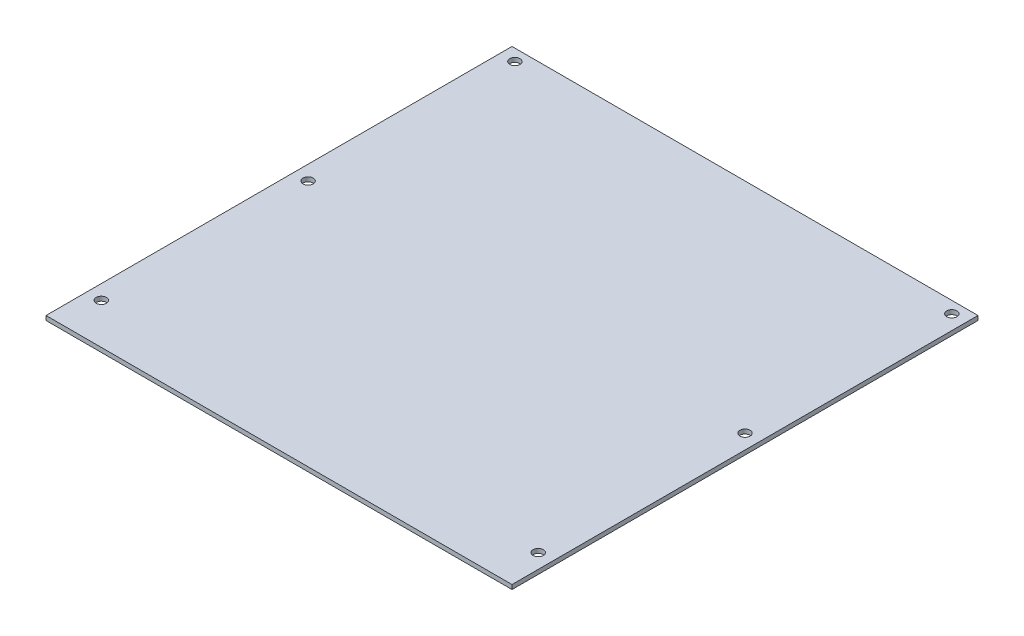
ISO-10303-21;
HEADER;
FILE_DESCRIPTION(('STEP AP214'),'2;1');
FILE_NAME('part.step','',(''),(''),'','','');
FILE_SCHEMA(('AUTOMOTIVE_DESIGN { 1 0 10303 214 1 1 1 1 }'));
ENDSEC;
DATA;
#1=APPLICATION_CONTEXT('core data for automotive mechanical design processes');
#2=APPLICATION_PROTOCOL_DEFINITION('international standard','automotive_design',2000,#1);
#3=PRODUCT_CONTEXT('',#1,'mechanical');
#4=PRODUCT('Part','Part','',(#3));
#5=PRODUCT_RELATED_PRODUCT_CATEGORY('part','',(#4));
#6=PRODUCT_DEFINITION_FORMATION('','',#4);
#7=PRODUCT_DEFINITION_CONTEXT('part definition',#1,'design');
#8=PRODUCT_DEFINITION('design','',#6,#7);
#9=PRODUCT_DEFINITION_SHAPE('','',#8);
#10=(LENGTH_UNIT() NAMED_UNIT(*) SI_UNIT(.MILLI.,.METRE.));
#11=(NAMED_UNIT(*) PLANE_ANGLE_UNIT() SI_UNIT($,.RADIAN.));
#12=(NAMED_UNIT(*) SI_UNIT($,.STERADIAN.) SOLID_ANGLE_UNIT());
#13=UNCERTAINTY_MEASURE_WITH_UNIT(LENGTH_MEASURE(1.E-05),#10,'distance_accuracy_value','');
#14=(GEOMETRIC_REPRESENTATION_CONTEXT(3) GLOBAL_UNCERTAINTY_ASSIGNED_CONTEXT((#13)) GLOBAL_UNIT_ASSIGNED_CONTEXT((#10,
#11,#12)) REPRESENTATION_CONTEXT('',''));
#15=CARTESIAN_POINT('',(0.,0.,0.));
#16=DIRECTION('',(0.,0.,1.));
#17=DIRECTION('',(1.,0.,0.));
#18=AXIS2_PLACEMENT_3D('',#15,#16,#17);
#19=CARTESIAN_POINT('',(0.,1.5,0.));
#20=DIRECTION('',(0.,1.,0.));
#21=DIRECTION('',(0.,0.,1.));
#22=AXIS2_PLACEMENT_3D('',#19,#20,#21);
#23=PLANE('',#22);
#24=CARTESIAN_POINT('',(75.,1.5,66.));
#25=DIRECTION('',(0.,1.,0.));
#26=DIRECTION('',(0.,0.,1.));
#27=AXIS2_PLACEMENT_3D('',#24,#25,#26);
#28=CIRCLE('',#27,1.75);
#29=CARTESIAN_POINT('',(75.,1.5,67.75));
#30=VERTEX_POINT('',#29);
#31=EDGE_CURVE('E141',#30,#30,#28,.T.);
#32=ORIENTED_EDGE('',*,*,#31,.F.);
#33=EDGE_LOOP('',(#32));
#34=FACE_BOUND('',#33,.T.);
#35=CARTESIAN_POINT('',(-75.,1.5,-4.99999999999994));
#36=DIRECTION('',(0.,1.,0.));
#37=DIRECTION('',(0.,0.,1.));
#38=AXIS2_PLACEMENT_3D('',#35,#36,#37);
#39=CIRCLE('',#38,1.75);
#40=CARTESIAN_POINT('',(-75.,1.5,-3.24999999999994));
#41=VERTEX_POINT('',#40);
#42=EDGE_CURVE('E129',#41,#41,#39,.T.);
#43=ORIENTED_EDGE('',*,*,#42,.F.);
#44=EDGE_LOOP('',(#43));
#45=FACE_BOUND('',#44,.T.);
#46=CARTESIAN_POINT('',(-75.,1.5,-75.9999999999999));
#47=DIRECTION('',(0.,1.,0.));
#48=DIRECTION('',(0.,0.,1.));
#49=AXIS2_PLACEMENT_3D('',#46,#47,#48);
#50=CIRCLE('',#49,1.75);
#51=CARTESIAN_POINT('',(-75.,1.5,-74.2499999999999));
#52=VERTEX_POINT('',#51);
#53=EDGE_CURVE('E108',#52,#52,#50,.T.);
#54=ORIENTED_EDGE('',*,*,#53,.F.);
#55=EDGE_LOOP('',(#54));
#56=FACE_BOUND('',#55,.T.);
#57=DIRECTION('',(0.,0.,-1.));
#58=VECTOR('',#57,1.);
#59=CARTESIAN_POINT('',(80.,1.5,-79.9999999999999));
#60=LINE('',#59,#58);
#61=CARTESIAN_POINT('',(80.0000000000001,1.5,80.0000000000001));
#62=VERTEX_POINT('',#61);
#63=CARTESIAN_POINT('',(80.,1.5,-79.9999999999999));
#64=VERTEX_POINT('',#63);
#65=EDGE_CURVE('E93',#62,#64,#60,.T.);
#66=ORIENTED_EDGE('',*,*,#65,.T.);
#67=DIRECTION('',(-1.,0.,0.));
#68=VECTOR('',#67,1.);
#69=CARTESIAN_POINT('',(-80.,1.5,-79.9999999999999));
#70=LINE('',#69,#68);
#71=CARTESIAN_POINT('',(-80.,1.5,-79.9999999999999));
#72=VERTEX_POINT('',#71);
#73=EDGE_CURVE('E88',#64,#72,#70,.T.);
#74=ORIENTED_EDGE('',*,*,#73,.T.);
#75=DIRECTION('',(0.,0.,1.));
#76=VECTOR('',#75,1.);
#77=CARTESIAN_POINT('',(-80.,1.5,-79.9999999999999));
#78=LINE('',#77,#76);
#79=CARTESIAN_POINT('',(-80.,1.5,80.0000000000001));
#80=VERTEX_POINT('',#79);
#81=EDGE_CURVE('E91',#72,#80,#78,.T.);
#82=ORIENTED_EDGE('',*,*,#81,.T.);
#83=DIRECTION('',(1.,0.,0.));
#84=VECTOR('',#83,1.);
#85=CARTESIAN_POINT('',(-80.,1.5,80.0000000000001));
#86=LINE('',#85,#84);
#87=EDGE_CURVE('E58',#80,#62,#86,.T.);
#88=ORIENTED_EDGE('',*,*,#87,.T.);
#89=EDGE_LOOP('',(#66,#74,#82,#88));
#90=FACE_BOUND('',#89,.T.);
#91=CARTESIAN_POINT('',(75.,1.5,-75.9999999999999));
#92=DIRECTION('',(0.,1.,0.));
#93=DIRECTION('',(0.,0.,-1.));
#94=AXIS2_PLACEMENT_3D('',#91,#92,#93);
#95=CIRCLE('',#94,1.75000000000001);
#96=CARTESIAN_POINT('',(75.,1.5,-77.75));
#97=VERTEX_POINT('',#96);
#98=EDGE_CURVE('E123',#97,#97,#95,.T.);
#99=ORIENTED_EDGE('',*,*,#98,.F.);
#100=EDGE_LOOP('',(#99));
#101=FACE_BOUND('',#100,.T.);
#102=CARTESIAN_POINT('',(-75.,1.5,66.0000000000001));
#103=DIRECTION('',(0.,1.,0.));
#104=DIRECTION('',(0.,0.,1.));
#105=AXIS2_PLACEMENT_3D('',#102,#103,#104);
#106=CIRCLE('',#105,1.75);
#107=CARTESIAN_POINT('',(-75.,1.5,67.7500000000001));
#108=VERTEX_POINT('',#107);
#109=EDGE_CURVE('E135',#108,#108,#106,.T.);
#110=ORIENTED_EDGE('',*,*,#109,.F.);
#111=EDGE_LOOP('',(#110));
#112=FACE_BOUND('',#111,.T.);
#113=CARTESIAN_POINT('',(75.,1.5,-4.99999999999995));
#114=DIRECTION('',(0.,1.,0.));
#115=DIRECTION('',(0.,0.,1.));
#116=AXIS2_PLACEMENT_3D('',#113,#114,#115);
#117=CIRCLE('',#116,1.75);
#118=CARTESIAN_POINT('',(75.,1.5,-3.24999999999995));
#119=VERTEX_POINT('',#118);
#120=EDGE_CURVE('E147',#119,#119,#117,.T.);
#121=ORIENTED_EDGE('',*,*,#120,.F.);
#122=EDGE_LOOP('',(#121));
#123=FACE_BOUND('',#122,.T.);
#124=ADVANCED_FACE('F41',(#34,#45,#56,#90,#101,#112,#123),#23,.T.);
#125=CARTESIAN_POINT('',(0.,0.,0.));
#126=DIRECTION('',(0.,1.,0.));
#127=DIRECTION('',(0.,0.,1.));
#128=AXIS2_PLACEMENT_3D('',#125,#126,#127);
#129=PLANE('',#128);
#130=DIRECTION('',(0.,0.,-1.));
#131=VECTOR('',#130,1.);
#132=CARTESIAN_POINT('',(80.,0.,-79.9999999999999));
#133=LINE('',#132,#131);
#134=CARTESIAN_POINT('',(80.0000000000001,0.,80.0000000000001));
#135=VERTEX_POINT('',#134);
#136=CARTESIAN_POINT('',(80.,0.,-79.9999999999999));
#137=VERTEX_POINT('',#136);
#138=EDGE_CURVE('E105',#135,#137,#133,.T.);
#139=ORIENTED_EDGE('',*,*,#138,.F.);
#140=DIRECTION('',(1.,0.,0.));
#141=VECTOR('',#140,1.);
#142=CARTESIAN_POINT('',(-80.,0.,80.0000000000001));
#143=LINE('',#142,#141);
#144=CARTESIAN_POINT('',(-80.,0.,80.0000000000001));
#145=VERTEX_POINT('',#144);
#146=EDGE_CURVE('E81',#145,#135,#143,.T.);
#147=ORIENTED_EDGE('',*,*,#146,.F.);
#148=DIRECTION('',(0.,0.,1.));
#149=VECTOR('',#148,1.);
#150=CARTESIAN_POINT('',(-80.,0.,-79.9999999999999));
#151=LINE('',#150,#149);
#152=CARTESIAN_POINT('',(-80.,0.,-79.9999999999999));
#153=VERTEX_POINT('',#152);
#154=EDGE_CURVE('E75',#153,#145,#151,.T.);
#155=ORIENTED_EDGE('',*,*,#154,.F.);
#156=DIRECTION('',(-1.,0.,0.));
#157=VECTOR('',#156,1.);
#158=CARTESIAN_POINT('',(-80.,0.,-79.9999999999999));
#159=LINE('',#158,#157);
#160=EDGE_CURVE('E97',#137,#153,#159,.T.);
#161=ORIENTED_EDGE('',*,*,#160,.F.);
#162=EDGE_LOOP('',(#139,#147,#155,#161));
#163=FACE_BOUND('',#162,.T.);
#164=CARTESIAN_POINT('',(-75.,0.,-75.9999999999999));
#165=DIRECTION('',(0.,1.,0.));
#166=DIRECTION('',(0.,0.,1.));
#167=AXIS2_PLACEMENT_3D('',#164,#165,#166);
#168=CIRCLE('',#167,1.75);
#169=CARTESIAN_POINT('',(-75.,0.,-74.2499999999999));
#170=VERTEX_POINT('',#169);
#171=EDGE_CURVE('E120',#170,#170,#168,.T.);
#172=ORIENTED_EDGE('',*,*,#171,.T.);
#173=EDGE_LOOP('',(#172));
#174=FACE_BOUND('',#173,.T.);
#175=CARTESIAN_POINT('',(75.,0.,-75.9999999999999));
#176=DIRECTION('',(0.,1.,0.));
#177=DIRECTION('',(0.,0.,-1.));
#178=AXIS2_PLACEMENT_3D('',#175,#176,#177);
#179=CIRCLE('',#178,1.75000000000001);
#180=CARTESIAN_POINT('',(75.,0.,-77.75));
#181=VERTEX_POINT('',#180);
#182=EDGE_CURVE('E126',#181,#181,#179,.T.);
#183=ORIENTED_EDGE('',*,*,#182,.T.);
#184=EDGE_LOOP('',(#183));
#185=FACE_BOUND('',#184,.T.);
#186=CARTESIAN_POINT('',(-75.,0.,-4.99999999999994));
#187=DIRECTION('',(0.,1.,0.));
#188=DIRECTION('',(0.,0.,1.));
#189=AXIS2_PLACEMENT_3D('',#186,#187,#188);
#190=CIRCLE('',#189,1.75);
#191=CARTESIAN_POINT('',(-75.,0.,-3.24999999999994));
#192=VERTEX_POINT('',#191);
#193=EDGE_CURVE('E132',#192,#192,#190,.T.);
#194=ORIENTED_EDGE('',*,*,#193,.T.);
#195=EDGE_LOOP('',(#194));
#196=FACE_BOUND('',#195,.T.);
#197=CARTESIAN_POINT('',(-75.,0.,66.0000000000001));
#198=DIRECTION('',(0.,1.,0.));
#199=DIRECTION('',(0.,0.,1.));
#200=AXIS2_PLACEMENT_3D('',#197,#198,#199);
#201=CIRCLE('',#200,1.75);
#202=CARTESIAN_POINT('',(-75.,0.,67.7500000000001));
#203=VERTEX_POINT('',#202);
#204=EDGE_CURVE('E138',#203,#203,#201,.T.);
#205=ORIENTED_EDGE('',*,*,#204,.T.);
#206=EDGE_LOOP('',(#205));
#207=FACE_BOUND('',#206,.T.);
#208=CARTESIAN_POINT('',(75.,0.,66.));
#209=DIRECTION('',(0.,1.,0.));
#210=DIRECTION('',(0.,0.,1.));
#211=AXIS2_PLACEMENT_3D('',#208,#209,#210);
#212=CIRCLE('',#211,1.75);
#213=CARTESIAN_POINT('',(75.,0.,67.75));
#214=VERTEX_POINT('',#213);
#215=EDGE_CURVE('E144',#214,#214,#212,.T.);
#216=ORIENTED_EDGE('',*,*,#215,.T.);
#217=EDGE_LOOP('',(#216));
#218=FACE_BOUND('',#217,.T.);
#219=CARTESIAN_POINT('',(75.,0.,-4.99999999999995));
#220=DIRECTION('',(0.,1.,0.));
#221=DIRECTION('',(0.,0.,1.));
#222=AXIS2_PLACEMENT_3D('',#219,#220,#221);
#223=CIRCLE('',#222,1.75);
#224=CARTESIAN_POINT('',(75.,0.,-3.24999999999995));
#225=VERTEX_POINT('',#224);
#226=EDGE_CURVE('E150',#225,#225,#223,.T.);
#227=ORIENTED_EDGE('',*,*,#226,.T.);
#228=EDGE_LOOP('',(#227));
#229=FACE_BOUND('',#228,.T.);
#230=ADVANCED_FACE('F116',(#163,#174,#185,#196,#207,#218,#229),#129,.F.);
#231=CARTESIAN_POINT('',(80.,1.5,-79.9999999999999));
#232=DIRECTION('',(-1.,0.,0.));
#233=DIRECTION('',(0.,0.,1.));
#234=AXIS2_PLACEMENT_3D('',#231,#232,#233);
#235=PLANE('',#234);
#236=ORIENTED_EDGE('',*,*,#138,.T.);
#237=DIRECTION('',(0.,-1.,0.));
#238=VECTOR('',#237,1.);
#239=CARTESIAN_POINT('',(80.,1.5,-79.9999999999999));
#240=LINE('',#239,#238);
#241=EDGE_CURVE('E11',#64,#137,#240,.T.);
#242=ORIENTED_EDGE('',*,*,#241,.F.);
#243=ORIENTED_EDGE('',*,*,#65,.F.);
#244=DIRECTION('',(0.,-1.,0.));
#245=VECTOR('',#244,1.);
#246=CARTESIAN_POINT('',(80.0000000000001,1.5,80.0000000000001));
#247=LINE('',#246,#245);
#248=EDGE_CURVE('E101',#62,#135,#247,.T.);
#249=ORIENTED_EDGE('',*,*,#248,.T.);
#250=EDGE_LOOP('',(#236,#242,#243,#249));
#251=FACE_BOUND('',#250,.T.);
#252=ADVANCED_FACE('F43',(#251),#235,.F.);
#253=CARTESIAN_POINT('',(-80.,1.5,-79.9999999999999));
#254=DIRECTION('',(0.,0.,1.));
#255=DIRECTION('',(1.,0.,0.));
#256=AXIS2_PLACEMENT_3D('',#253,#254,#255);
#257=PLANE('',#256);
#258=ORIENTED_EDGE('',*,*,#160,.T.);
#259=DIRECTION('',(0.,-1.,0.));
#260=VECTOR('',#259,1.);
#261=CARTESIAN_POINT('',(-80.,1.5,-79.9999999999999));
#262=LINE('',#261,#260);
#263=EDGE_CURVE('E50',#72,#153,#262,.T.);
#264=ORIENTED_EDGE('',*,*,#263,.F.);
#265=ORIENTED_EDGE('',*,*,#73,.F.);
#266=ORIENTED_EDGE('',*,*,#241,.T.);
#267=EDGE_LOOP('',(#258,#264,#265,#266));
#268=FACE_BOUND('',#267,.T.);
#269=ADVANCED_FACE('F96',(#268),#257,.F.);
#270=CARTESIAN_POINT('',(-80.,1.5,-79.9999999999999));
#271=DIRECTION('',(1.,0.,0.));
#272=DIRECTION('',(0.,0.,-1.));
#273=AXIS2_PLACEMENT_3D('',#270,#271,#272);
#274=PLANE('',#273);
#275=ORIENTED_EDGE('',*,*,#154,.T.);
#276=DIRECTION('',(0.,-1.,0.));
#277=VECTOR('',#276,1.);
#278=CARTESIAN_POINT('',(-80.,1.5,80.0000000000001));
#279=LINE('',#278,#277);
#280=EDGE_CURVE('E98',#80,#145,#279,.T.);
#281=ORIENTED_EDGE('',*,*,#280,.F.);
#282=ORIENTED_EDGE('',*,*,#81,.F.);
#283=ORIENTED_EDGE('',*,*,#263,.T.);
#284=EDGE_LOOP('',(#275,#281,#282,#283));
#285=FACE_BOUND('',#284,.T.);
#286=ADVANCED_FACE('F99',(#285),#274,.F.);
#287=CARTESIAN_POINT('',(-80.,1.5,80.0000000000001));
#288=DIRECTION('',(0.,0.,-1.));
#289=DIRECTION('',(-1.,0.,0.));
#290=AXIS2_PLACEMENT_3D('',#287,#288,#289);
#291=PLANE('',#290);
#292=ORIENTED_EDGE('',*,*,#146,.T.);
#293=ORIENTED_EDGE('',*,*,#248,.F.);
#294=ORIENTED_EDGE('',*,*,#87,.F.);
#295=ORIENTED_EDGE('',*,*,#280,.T.);
#296=EDGE_LOOP('',(#292,#293,#294,#295));
#297=FACE_BOUND('',#296,.T.);
#298=ADVANCED_FACE('F113',(#297),#291,.F.);
#299=CARTESIAN_POINT('',(-75.,1.5,-75.9999999999999));
#300=DIRECTION('',(0.,-1.,0.));
#301=DIRECTION('',(0.,0.,-1.));
#302=AXIS2_PLACEMENT_3D('',#299,#300,#301);
#303=CYLINDRICAL_SURFACE('',#302,1.75);
#304=ORIENTED_EDGE('',*,*,#53,.T.);
#305=EDGE_LOOP('',(#304));
#306=FACE_BOUND('',#305,.T.);
#307=ORIENTED_EDGE('',*,*,#171,.F.);
#308=EDGE_LOOP('',(#307));
#309=FACE_BOUND('',#308,.T.);
#310=ADVANCED_FACE('F169',(#306,#309),#303,.F.);
#311=CARTESIAN_POINT('',(75.,1.5,-75.9999999999999));
#312=DIRECTION('',(0.,-1.,0.));
#313=DIRECTION('',(0.,0.,-1.));
#314=AXIS2_PLACEMENT_3D('',#311,#312,#313);
#315=CYLINDRICAL_SURFACE('',#314,1.75000000000001);
#316=ORIENTED_EDGE('',*,*,#98,.T.);
#317=EDGE_LOOP('',(#316));
#318=FACE_BOUND('',#317,.T.);
#319=ORIENTED_EDGE('',*,*,#182,.F.);
#320=EDGE_LOOP('',(#319));
#321=FACE_BOUND('',#320,.T.);
#322=ADVANCED_FACE('F214',(#318,#321),#315,.F.);
#323=CARTESIAN_POINT('',(-75.,1.5,-4.99999999999994));
#324=DIRECTION('',(0.,-1.,0.));
#325=DIRECTION('',(0.,0.,-1.));
#326=AXIS2_PLACEMENT_3D('',#323,#324,#325);
#327=CYLINDRICAL_SURFACE('',#326,1.75);
#328=ORIENTED_EDGE('',*,*,#42,.T.);
#329=EDGE_LOOP('',(#328));
#330=FACE_BOUND('',#329,.T.);
#331=ORIENTED_EDGE('',*,*,#193,.F.);
#332=EDGE_LOOP('',(#331));
#333=FACE_BOUND('',#332,.T.);
#334=ADVANCED_FACE('F222',(#330,#333),#327,.F.);
#335=CARTESIAN_POINT('',(-75.,1.5,66.0000000000001));
#336=DIRECTION('',(0.,-1.,0.));
#337=DIRECTION('',(0.,0.,-1.));
#338=AXIS2_PLACEMENT_3D('',#335,#336,#337);
#339=CYLINDRICAL_SURFACE('',#338,1.75);
#340=ORIENTED_EDGE('',*,*,#109,.T.);
#341=EDGE_LOOP('',(#340));
#342=FACE_BOUND('',#341,.T.);
#343=ORIENTED_EDGE('',*,*,#204,.F.);
#344=EDGE_LOOP('',(#343));
#345=FACE_BOUND('',#344,.T.);
#346=ADVANCED_FACE('F230',(#342,#345),#339,.F.);
#347=CARTESIAN_POINT('',(75.,1.5,66.));
#348=DIRECTION('',(0.,-1.,0.));
#349=DIRECTION('',(0.,0.,-1.));
#350=AXIS2_PLACEMENT_3D('',#347,#348,#349);
#351=CYLINDRICAL_SURFACE('',#350,1.75);
#352=ORIENTED_EDGE('',*,*,#31,.T.);
#353=EDGE_LOOP('',(#352));
#354=FACE_BOUND('',#353,.T.);
#355=ORIENTED_EDGE('',*,*,#215,.F.);
#356=EDGE_LOOP('',(#355));
#357=FACE_BOUND('',#356,.T.);
#358=ADVANCED_FACE('F239',(#354,#357),#351,.F.);
#359=CARTESIAN_POINT('',(75.,1.5,-4.99999999999995));
#360=DIRECTION('',(0.,-1.,0.));
#361=DIRECTION('',(0.,0.,-1.));
#362=AXIS2_PLACEMENT_3D('',#359,#360,#361);
#363=CYLINDRICAL_SURFACE('',#362,1.75);
#364=ORIENTED_EDGE('',*,*,#120,.T.);
#365=EDGE_LOOP('',(#364));
#366=FACE_BOUND('',#365,.T.);
#367=ORIENTED_EDGE('',*,*,#226,.F.);
#368=EDGE_LOOP('',(#367));
#369=FACE_BOUND('',#368,.T.);
#370=ADVANCED_FACE('F156',(#366,#369),#363,.F.);
#371=CLOSED_SHELL('',(#124,#230,#252,#269,#286,#298,#310,#322,#334,#346,#358,#370));
#372=MANIFOLD_SOLID_BREP('B2',#371);
#373=ADVANCED_BREP_SHAPE_REPRESENTATION('',(#18,#372),#14);
#374=SHAPE_DEFINITION_REPRESENTATION(#9,#373);
ENDSEC;
END-ISO-10303-21;
